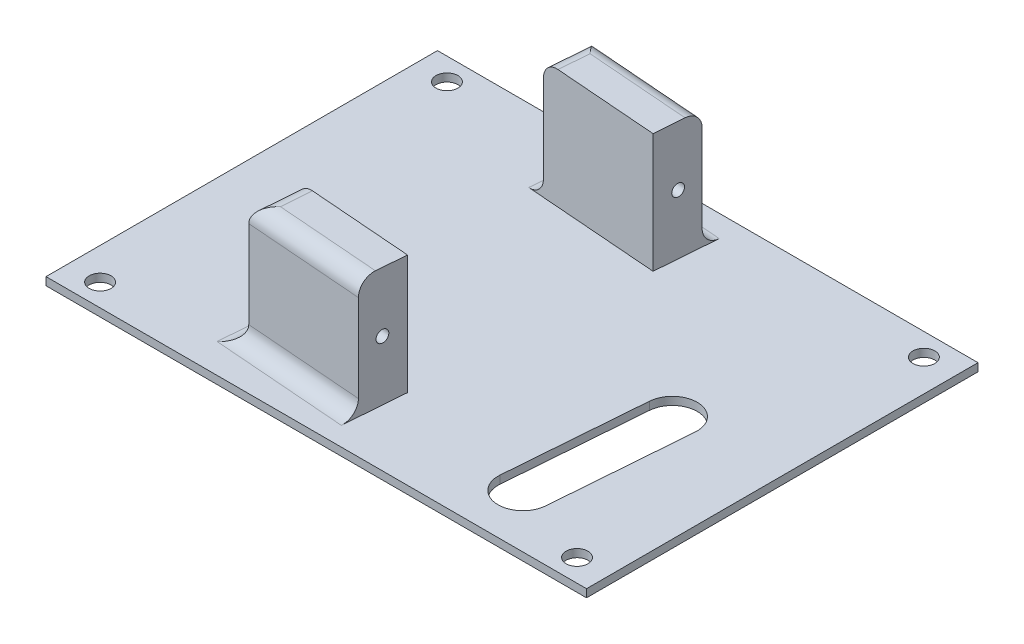
ISO-10303-21;
HEADER;
FILE_DESCRIPTION(('STEP AP214'),'2;1');
FILE_NAME('part.step','',(''),(''),'','','');
FILE_SCHEMA(('AUTOMOTIVE_DESIGN { 1 0 10303 214 1 1 1 1 }'));
ENDSEC;
DATA;
#1=APPLICATION_CONTEXT('core data for automotive mechanical design processes');
#2=APPLICATION_PROTOCOL_DEFINITION('international standard','automotive_design',2000,#1);
#3=PRODUCT_CONTEXT('',#1,'mechanical');
#4=PRODUCT('Part','Part','',(#3));
#5=PRODUCT_RELATED_PRODUCT_CATEGORY('part','',(#4));
#6=PRODUCT_DEFINITION_FORMATION('','',#4);
#7=PRODUCT_DEFINITION_CONTEXT('part definition',#1,'design');
#8=PRODUCT_DEFINITION('design','',#6,#7);
#9=PRODUCT_DEFINITION_SHAPE('','',#8);
#10=(LENGTH_UNIT() NAMED_UNIT(*) SI_UNIT(.MILLI.,.METRE.));
#11=(NAMED_UNIT(*) PLANE_ANGLE_UNIT() SI_UNIT($,.RADIAN.));
#12=(NAMED_UNIT(*) SI_UNIT($,.STERADIAN.) SOLID_ANGLE_UNIT());
#13=UNCERTAINTY_MEASURE_WITH_UNIT(LENGTH_MEASURE(1.E-05),#10,'distance_accuracy_value','');
#14=(GEOMETRIC_REPRESENTATION_CONTEXT(3) GLOBAL_UNCERTAINTY_ASSIGNED_CONTEXT((#13)) GLOBAL_UNIT_ASSIGNED_CONTEXT((#10,
#11,#12)) REPRESENTATION_CONTEXT('',''));
#15=CARTESIAN_POINT('',(0.,0.,0.));
#16=DIRECTION('',(0.,0.,1.));
#17=DIRECTION('',(1.,0.,0.));
#18=AXIS2_PLACEMENT_3D('',#15,#16,#17);
#19=CARTESIAN_POINT('',(0.,0.8,0.));
#20=DIRECTION('',(1.,0.,0.));
#21=DIRECTION('',(0.,0.,-1.));
#22=AXIS2_PLACEMENT_3D('',#19,#20,#21);
#23=PLANE('',#22);
#24=DIRECTION('',(0.,0.,1.));
#25=VECTOR('',#24,1.);
#26=CARTESIAN_POINT('',(0.,0.,0.));
#27=LINE('',#26,#25);
#28=CARTESIAN_POINT('',(0.,0.,-39.4));
#29=VERTEX_POINT('',#28);
#30=CARTESIAN_POINT('',(0.,0.,0.));
#31=VERTEX_POINT('',#30);
#32=EDGE_CURVE('E306',#29,#31,#27,.T.);
#33=ORIENTED_EDGE('',*,*,#32,.T.);
#34=DIRECTION('',(0.,-1.,0.));
#35=VECTOR('',#34,1.);
#36=CARTESIAN_POINT('',(0.,0.8,0.));
#37=LINE('',#36,#35);
#38=CARTESIAN_POINT('',(0.,0.8,0.));
#39=VERTEX_POINT('',#38);
#40=EDGE_CURVE('E335',#39,#31,#37,.T.);
#41=ORIENTED_EDGE('',*,*,#40,.F.);
#42=DIRECTION('',(0.,0.,1.));
#43=VECTOR('',#42,1.);
#44=CARTESIAN_POINT('',(0.,0.8,0.));
#45=LINE('',#44,#43);
#46=CARTESIAN_POINT('',(0.,0.8,-39.4));
#47=VERTEX_POINT('',#46);
#48=EDGE_CURVE('E309',#47,#39,#45,.T.);
#49=ORIENTED_EDGE('',*,*,#48,.F.);
#50=DIRECTION('',(0.,-1.,0.));
#51=VECTOR('',#50,1.);
#52=CARTESIAN_POINT('',(0.,0.8,-39.4));
#53=LINE('',#52,#51);
#54=EDGE_CURVE('E319',#47,#29,#53,.T.);
#55=ORIENTED_EDGE('',*,*,#54,.T.);
#56=EDGE_LOOP('',(#33,#41,#49,#55));
#57=FACE_BOUND('',#56,.T.);
#58=ADVANCED_FACE('F43',(#57),#23,.F.);
#59=CARTESIAN_POINT('',(0.,0.8,0.));
#60=DIRECTION('',(0.,0.,-1.));
#61=DIRECTION('',(-1.,0.,0.));
#62=AXIS2_PLACEMENT_3D('',#59,#60,#61);
#63=PLANE('',#62);
#64=DIRECTION('',(1.,0.,0.));
#65=VECTOR('',#64,1.);
#66=CARTESIAN_POINT('',(0.,0.,0.));
#67=LINE('',#66,#65);
#68=CARTESIAN_POINT('',(54.4,0.,0.));
#69=VERTEX_POINT('',#68);
#70=EDGE_CURVE('E322',#31,#69,#67,.T.);
#71=ORIENTED_EDGE('',*,*,#70,.T.);
#72=DIRECTION('',(0.,-1.,0.));
#73=VECTOR('',#72,1.);
#74=CARTESIAN_POINT('',(54.4,0.8,0.));
#75=LINE('',#74,#73);
#76=CARTESIAN_POINT('',(54.4,0.8,0.));
#77=VERTEX_POINT('',#76);
#78=EDGE_CURVE('E332',#77,#69,#75,.T.);
#79=ORIENTED_EDGE('',*,*,#78,.F.);
#80=DIRECTION('',(1.,0.,0.));
#81=VECTOR('',#80,1.);
#82=CARTESIAN_POINT('',(0.,0.8,0.));
#83=LINE('',#82,#81);
#84=EDGE_CURVE('E312',#39,#77,#83,.T.);
#85=ORIENTED_EDGE('',*,*,#84,.F.);
#86=ORIENTED_EDGE('',*,*,#40,.T.);
#87=EDGE_LOOP('',(#71,#79,#85,#86));
#88=FACE_BOUND('',#87,.T.);
#89=ADVANCED_FACE('F449',(#88),#63,.F.);
#90=CARTESIAN_POINT('',(54.4,0.8,0.));
#91=DIRECTION('',(-1.,0.,0.));
#92=DIRECTION('',(0.,0.,1.));
#93=AXIS2_PLACEMENT_3D('',#90,#91,#92);
#94=PLANE('',#93);
#95=DIRECTION('',(0.,0.,-1.));
#96=VECTOR('',#95,1.);
#97=CARTESIAN_POINT('',(54.4,0.,0.));
#98=LINE('',#97,#96);
#99=CARTESIAN_POINT('',(54.4,0.,-39.4));
#100=VERTEX_POINT('',#99);
#101=EDGE_CURVE('E324',#69,#100,#98,.T.);
#102=ORIENTED_EDGE('',*,*,#101,.T.);
#103=DIRECTION('',(0.,-1.,0.));
#104=VECTOR('',#103,1.);
#105=CARTESIAN_POINT('',(54.4,0.8,-39.4));
#106=LINE('',#105,#104);
#107=CARTESIAN_POINT('',(54.4,0.8,-39.4));
#108=VERTEX_POINT('',#107);
#109=EDGE_CURVE('E329',#108,#100,#106,.T.);
#110=ORIENTED_EDGE('',*,*,#109,.F.);
#111=DIRECTION('',(0.,0.,-1.));
#112=VECTOR('',#111,1.);
#113=CARTESIAN_POINT('',(54.4,0.8,0.));
#114=LINE('',#113,#112);
#115=EDGE_CURVE('E315',#77,#108,#114,.T.);
#116=ORIENTED_EDGE('',*,*,#115,.F.);
#117=ORIENTED_EDGE('',*,*,#78,.T.);
#118=EDGE_LOOP('',(#102,#110,#116,#117));
#119=FACE_BOUND('',#118,.T.);
#120=ADVANCED_FACE('F455',(#119),#94,.F.);
#121=CARTESIAN_POINT('',(0.,0.8,-39.4));
#122=DIRECTION('',(0.,0.,1.));
#123=DIRECTION('',(1.,0.,0.));
#124=AXIS2_PLACEMENT_3D('',#121,#122,#123);
#125=PLANE('',#124);
#126=DIRECTION('',(-1.,0.,0.));
#127=VECTOR('',#126,1.);
#128=CARTESIAN_POINT('',(0.,0.,-39.4));
#129=LINE('',#128,#127);
#130=EDGE_CURVE('E313',#100,#29,#129,.T.);
#131=ORIENTED_EDGE('',*,*,#130,.T.);
#132=ORIENTED_EDGE('',*,*,#54,.F.);
#133=DIRECTION('',(-1.,0.,0.));
#134=VECTOR('',#133,1.);
#135=CARTESIAN_POINT('',(0.,0.8,-39.4));
#136=LINE('',#135,#134);
#137=EDGE_CURVE('E317',#108,#47,#136,.T.);
#138=ORIENTED_EDGE('',*,*,#137,.F.);
#139=ORIENTED_EDGE('',*,*,#109,.T.);
#140=EDGE_LOOP('',(#131,#132,#138,#139));
#141=FACE_BOUND('',#140,.T.);
#142=ADVANCED_FACE('F655',(#141),#125,.F.);
#143=CARTESIAN_POINT('',(0.,0.8,0.));
#144=DIRECTION('',(0.,-1.,0.));
#145=DIRECTION('',(0.,0.,-1.));
#146=AXIS2_PLACEMENT_3D('',#143,#144,#145);
#147=PLANE('',#146);
#148=CARTESIAN_POINT('',(42.6363450689998,0.8,-5.36196488668117));
#149=DIRECTION('',(0.,1.,0.));
#150=DIRECTION('',(0.,0.,1.));
#151=AXIS2_PLACEMENT_3D('',#148,#149,#150);
#152=CIRCLE('',#151,2.5);
#153=CARTESIAN_POINT('',(40.1438476958249,0.8,-5.55550259545118));
#154=VERTEX_POINT('',#153);
#155=CARTESIAN_POINT('',(45.1288424421748,0.8,-5.16842717791116));
#156=VERTEX_POINT('',#155);
#157=EDGE_CURVE('E233',#154,#156,#152,.T.);
#158=ORIENTED_EDGE('',*,*,#157,.F.);
#159=DIRECTION('',(-0.0774150835080043,0.,0.996998949269982));
#160=VECTOR('',#159,1.);
#161=CARTESIAN_POINT('',(39.4744727903479,0.8,3.06511818265889));
#162=LINE('',#161,#160);
#163=CARTESIAN_POINT('',(41.227658864937,0.8,-19.5134878852309));
#164=VERTEX_POINT('',#163);
#165=EDGE_CURVE('E203',#164,#154,#162,.T.);
#166=ORIENTED_EDGE('',*,*,#165,.F.);
#167=CARTESIAN_POINT('',(43.7201562381119,0.8,-19.3199501764609));
#168=DIRECTION('',(0.,1.,0.));
#169=DIRECTION('',(0.,0.,1.));
#170=AXIS2_PLACEMENT_3D('',#167,#168,#169);
#171=CIRCLE('',#170,2.5);
#172=CARTESIAN_POINT('',(46.2126536112869,0.8,-19.1264124676909));
#173=VERTEX_POINT('',#172);
#174=EDGE_CURVE('E221',#173,#164,#171,.T.);
#175=ORIENTED_EDGE('',*,*,#174,.F.);
#176=DIRECTION('',(-0.0774150835080043,0.,0.996998949269982));
#177=VECTOR('',#176,1.);
#178=CARTESIAN_POINT('',(44.4594675366978,0.8,3.45219360019891));
#179=LINE('',#178,#177);
#180=EDGE_CURVE('E224',#173,#156,#179,.T.);
#181=ORIENTED_EDGE('',*,*,#180,.T.);
#182=EDGE_LOOP('',(#158,#166,#175,#181));
#183=FACE_BOUND('',#182,.T.);
#184=DIRECTION('',(0.996998949269982,0.,0.0774150835080046));
#185=VECTOR('',#184,1.);
#186=CARTESIAN_POINT('',(3.05375947752351,0.8,-39.3281884156255));
#187=LINE('',#186,#185);
#188=CARTESIAN_POINT('',(17.0050591665599,0.8,-38.2448963707715));
#189=VERTEX_POINT('',#188);
#190=CARTESIAN_POINT('',(30.5642448766316,0.8,-37.1920512350627));
#191=VERTEX_POINT('',#190);
#192=EDGE_CURVE('E379',#189,#191,#187,.T.);
#193=ORIENTED_EDGE('',*,*,#192,.T.);
#194=DIRECTION('',(-0.077415083508005,0.,0.996998949269982));
#195=VECTOR('',#194,1.);
#196=CARTESIAN_POINT('',(27.5104853991081,0.8,2.13613718056285));
#197=LINE('',#196,#195);
#198=CARTESIAN_POINT('',(30.084271358882,0.8,-31.0106577495888));
#199=VERTEX_POINT('',#198);
#200=EDGE_CURVE('E60',#191,#199,#197,.T.);
#201=ORIENTED_EDGE('',*,*,#200,.T.);
#202=DIRECTION('',(0.996998949269982,0.,0.0774150835080049));
#203=VECTOR('',#202,1.);
#204=CARTESIAN_POINT('',(2.57378595977389,0.8,-33.1467949301516));
#205=LINE('',#204,#203);
#206=CARTESIAN_POINT('',(16.5250856488103,0.8,-32.0635028852977));
#207=VERTEX_POINT('',#206);
#208=EDGE_CURVE('E240',#207,#199,#205,.T.);
#209=ORIENTED_EDGE('',*,*,#208,.F.);
#210=DIRECTION('',(-0.0774150835080041,0.,0.996998949269982));
#211=VECTOR('',#210,1.);
#212=CARTESIAN_POINT('',(16.8811950329471,0.8,-36.6496980519396));
#213=LINE('',#212,#211);
#214=EDGE_CURVE('E68',#207,#189,#213,.F.);
#215=ORIENTED_EDGE('',*,*,#214,.T.);
#216=EDGE_LOOP('',(#193,#201,#209,#215));
#217=FACE_BOUND('',#216,.T.);
#218=DIRECTION('',(-0.0774150835080049,0.,0.996998949269982));
#219=VECTOR('',#218,1.);
#220=CARTESIAN_POINT('',(14.7445387281261,0.8,-9.13252705208806));
#221=LINE('',#220,#219);
#222=CARTESIAN_POINT('',(14.2645652103765,0.8,-2.95113356661417));
#223=VERTEX_POINT('',#222);
#224=CARTESIAN_POINT('',(14.7445387281261,0.8,-9.13252705208806));
#225=VERTEX_POINT('',#224);
#226=EDGE_CURVE('E375',#223,#225,#221,.F.);
#227=ORIENTED_EDGE('',*,*,#226,.T.);
#228=DIRECTION('',(0.996998949269982,0.,0.0774150835080043));
#229=VECTOR('',#228,1.);
#230=CARTESIAN_POINT('',(0.793239039089771,0.8,-10.215819096942));
#231=LINE('',#230,#229);
#232=CARTESIAN_POINT('',(28.3037244381979,0.8,-8.0796819163792));
#233=VERTEX_POINT('',#232);
#234=EDGE_CURVE('E262',#225,#233,#231,.T.);
#235=ORIENTED_EDGE('',*,*,#234,.T.);
#236=DIRECTION('',(0.0774150835080042,0.,-0.996998949269982));
#237=VECTOR('',#236,1.);
#238=CARTESIAN_POINT('',(27.5104853991081,0.8,2.13613718056283));
#239=LINE('',#238,#237);
#240=CARTESIAN_POINT('',(27.8237509204483,0.8,-1.89828843090531));
#241=VERTEX_POINT('',#240);
#242=EDGE_CURVE('E267',#241,#233,#239,.T.);
#243=ORIENTED_EDGE('',*,*,#242,.F.);
#244=DIRECTION('',(0.996998949269982,0.,0.0774150835080045));
#245=VECTOR('',#244,1.);
#246=CARTESIAN_POINT('',(15.8597635292085,0.8,-2.82726943300136));
#247=LINE('',#246,#245);
#248=EDGE_CURVE('E373',#241,#223,#247,.F.);
#249=ORIENTED_EDGE('',*,*,#248,.T.);
#250=EDGE_LOOP('',(#227,#235,#243,#249));
#251=FACE_BOUND('',#250,.T.);
#252=CARTESIAN_POINT('',(3.2,0.8,-37.155));
#253=DIRECTION('',(0.,1.,0.));
#254=DIRECTION('',(0.,0.,1.));
#255=AXIS2_PLACEMENT_3D('',#252,#253,#254);
#256=CIRCLE('',#255,1.1);
#257=CARTESIAN_POINT('',(3.2,0.8,-36.055));
#258=VERTEX_POINT('',#257);
#259=EDGE_CURVE('E298',#258,#258,#256,.T.);
#260=ORIENTED_EDGE('',*,*,#259,.F.);
#261=EDGE_LOOP('',(#260));
#262=FACE_BOUND('',#261,.T.);
#263=CARTESIAN_POINT('',(51.2,0.8,-2.24500000000001));
#264=DIRECTION('',(0.,1.,0.));
#265=DIRECTION('',(0.,0.,1.));
#266=AXIS2_PLACEMENT_3D('',#263,#264,#265);
#267=CIRCLE('',#266,1.1);
#268=CARTESIAN_POINT('',(51.2,0.8,-1.14500000000001));
#269=VERTEX_POINT('',#268);
#270=EDGE_CURVE('E292',#269,#269,#267,.T.);
#271=ORIENTED_EDGE('',*,*,#270,.F.);
#272=EDGE_LOOP('',(#271));
#273=FACE_BOUND('',#272,.T.);
#274=CARTESIAN_POINT('',(3.2,0.8,-2.245));
#275=DIRECTION('',(0.,1.,0.));
#276=DIRECTION('',(0.,0.,1.));
#277=AXIS2_PLACEMENT_3D('',#274,#275,#276);
#278=CIRCLE('',#277,1.1);
#279=CARTESIAN_POINT('',(3.2,0.8,-1.145));
#280=VERTEX_POINT('',#279);
#281=EDGE_CURVE('E285',#280,#280,#278,.T.);
#282=ORIENTED_EDGE('',*,*,#281,.F.);
#283=EDGE_LOOP('',(#282));
#284=FACE_BOUND('',#283,.T.);
#285=CARTESIAN_POINT('',(51.2,0.8,-37.155));
#286=DIRECTION('',(0.,1.,0.));
#287=DIRECTION('',(0.,0.,1.));
#288=AXIS2_PLACEMENT_3D('',#285,#286,#287);
#289=CIRCLE('',#288,1.1);
#290=CARTESIAN_POINT('',(51.2,0.8,-36.055));
#291=VERTEX_POINT('',#290);
#292=EDGE_CURVE('E288',#291,#291,#289,.T.);
#293=ORIENTED_EDGE('',*,*,#292,.F.);
#294=EDGE_LOOP('',(#293));
#295=FACE_BOUND('',#294,.T.);
#296=ORIENTED_EDGE('',*,*,#48,.T.);
#297=ORIENTED_EDGE('',*,*,#84,.T.);
#298=ORIENTED_EDGE('',*,*,#115,.T.);
#299=ORIENTED_EDGE('',*,*,#137,.T.);
#300=EDGE_LOOP('',(#296,#297,#298,#299));
#301=FACE_BOUND('',#300,.T.);
#302=ADVANCED_FACE('F429',(#183,#217,#251,#262,#273,#284,#295,#301),#147,.F.);
#303=CARTESIAN_POINT('',(0.,0.,0.));
#304=DIRECTION('',(0.,-1.,0.));
#305=DIRECTION('',(0.,0.,-1.));
#306=AXIS2_PLACEMENT_3D('',#303,#304,#305);
#307=PLANE('',#306);
#308=DIRECTION('',(-0.0774150835080043,0.,0.996998949269982));
#309=VECTOR('',#308,1.);
#310=CARTESIAN_POINT('',(39.4744727903479,0.,3.06511818265889));
#311=LINE('',#310,#309);
#312=CARTESIAN_POINT('',(41.227658864937,0.,-19.5134878852309));
#313=VERTEX_POINT('',#312);
#314=CARTESIAN_POINT('',(40.1438476958249,0.,-5.55550259545118));
#315=VERTEX_POINT('',#314);
#316=EDGE_CURVE('E200',#313,#315,#311,.T.);
#317=ORIENTED_EDGE('',*,*,#316,.T.);
#318=CARTESIAN_POINT('',(42.6363450689998,0.,-5.36196488668117));
#319=DIRECTION('',(0.,1.,0.));
#320=DIRECTION('',(0.,0.,1.));
#321=AXIS2_PLACEMENT_3D('',#318,#319,#320);
#322=CIRCLE('',#321,2.5);
#323=CARTESIAN_POINT('',(45.1288424421748,0.,-5.16842717791116));
#324=VERTEX_POINT('',#323);
#325=EDGE_CURVE('E211',#315,#324,#322,.T.);
#326=ORIENTED_EDGE('',*,*,#325,.T.);
#327=DIRECTION('',(-0.0774150835080043,0.,0.996998949269982));
#328=VECTOR('',#327,1.);
#329=CARTESIAN_POINT('',(44.4594675366978,0.,3.45219360019891));
#330=LINE('',#329,#328);
#331=CARTESIAN_POINT('',(46.2126536112869,0.,-19.1264124676909));
#332=VERTEX_POINT('',#331);
#333=EDGE_CURVE('E216',#332,#324,#330,.T.);
#334=ORIENTED_EDGE('',*,*,#333,.F.);
#335=CARTESIAN_POINT('',(43.7201562381119,0.,-19.3199501764609));
#336=DIRECTION('',(0.,1.,0.));
#337=DIRECTION('',(0.,0.,1.));
#338=AXIS2_PLACEMENT_3D('',#335,#336,#337);
#339=CIRCLE('',#338,2.5);
#340=EDGE_CURVE('E208',#332,#313,#339,.T.);
#341=ORIENTED_EDGE('',*,*,#340,.T.);
#342=EDGE_LOOP('',(#317,#326,#334,#341));
#343=FACE_BOUND('',#342,.T.);
#344=CARTESIAN_POINT('',(3.2,0.,-37.155));
#345=DIRECTION('',(0.,1.,0.));
#346=DIRECTION('',(0.,0.,1.));
#347=AXIS2_PLACEMENT_3D('',#344,#345,#346);
#348=CIRCLE('',#347,1.1);
#349=CARTESIAN_POINT('',(3.2,0.,-36.055));
#350=VERTEX_POINT('',#349);
#351=EDGE_CURVE('E284',#350,#350,#348,.T.);
#352=ORIENTED_EDGE('',*,*,#351,.T.);
#353=EDGE_LOOP('',(#352));
#354=FACE_BOUND('',#353,.T.);
#355=CARTESIAN_POINT('',(51.2,0.,-2.24500000000001));
#356=DIRECTION('',(0.,1.,0.));
#357=DIRECTION('',(0.,0.,1.));
#358=AXIS2_PLACEMENT_3D('',#355,#356,#357);
#359=CIRCLE('',#358,1.1);
#360=CARTESIAN_POINT('',(51.2,0.,-1.14500000000001));
#361=VERTEX_POINT('',#360);
#362=EDGE_CURVE('E295',#361,#361,#359,.T.);
#363=ORIENTED_EDGE('',*,*,#362,.T.);
#364=EDGE_LOOP('',(#363));
#365=FACE_BOUND('',#364,.T.);
#366=CARTESIAN_POINT('',(3.2,0.,-2.245));
#367=DIRECTION('',(0.,1.,0.));
#368=DIRECTION('',(0.,0.,1.));
#369=AXIS2_PLACEMENT_3D('',#366,#367,#368);
#370=CIRCLE('',#369,1.1);
#371=CARTESIAN_POINT('',(3.2,0.,-1.145));
#372=VERTEX_POINT('',#371);
#373=EDGE_CURVE('E289',#372,#372,#370,.T.);
#374=ORIENTED_EDGE('',*,*,#373,.T.);
#375=EDGE_LOOP('',(#374));
#376=FACE_BOUND('',#375,.T.);
#377=CARTESIAN_POINT('',(51.2,0.,-37.155));
#378=DIRECTION('',(0.,1.,0.));
#379=DIRECTION('',(0.,0.,1.));
#380=AXIS2_PLACEMENT_3D('',#377,#378,#379);
#381=CIRCLE('',#380,1.1);
#382=CARTESIAN_POINT('',(51.2,0.,-36.055));
#383=VERTEX_POINT('',#382);
#384=EDGE_CURVE('E303',#383,#383,#381,.T.);
#385=ORIENTED_EDGE('',*,*,#384,.T.);
#386=EDGE_LOOP('',(#385));
#387=FACE_BOUND('',#386,.T.);
#388=ORIENTED_EDGE('',*,*,#32,.F.);
#389=ORIENTED_EDGE('',*,*,#130,.F.);
#390=ORIENTED_EDGE('',*,*,#101,.F.);
#391=ORIENTED_EDGE('',*,*,#70,.F.);
#392=EDGE_LOOP('',(#388,#389,#390,#391));
#393=FACE_BOUND('',#392,.T.);
#394=ADVANCED_FACE('F218',(#343,#354,#365,#376,#387,#393),#307,.T.);
#395=CARTESIAN_POINT('',(51.2,0.,-37.155));
#396=DIRECTION('',(0.,1.,0.));
#397=DIRECTION('',(0.,0.,1.));
#398=AXIS2_PLACEMENT_3D('',#395,#396,#397);
#399=CYLINDRICAL_SURFACE('',#398,1.1);
#400=ORIENTED_EDGE('',*,*,#384,.F.);
#401=EDGE_LOOP('',(#400));
#402=FACE_BOUND('',#401,.T.);
#403=ORIENTED_EDGE('',*,*,#292,.T.);
#404=EDGE_LOOP('',(#403));
#405=FACE_BOUND('',#404,.T.);
#406=ADVANCED_FACE('F671',(#402,#405),#399,.F.);
#407=CARTESIAN_POINT('',(3.2,0.,-2.245));
#408=DIRECTION('',(0.,1.,0.));
#409=DIRECTION('',(0.,0.,1.));
#410=AXIS2_PLACEMENT_3D('',#407,#408,#409);
#411=CYLINDRICAL_SURFACE('',#410,1.1);
#412=ORIENTED_EDGE('',*,*,#373,.F.);
#413=EDGE_LOOP('',(#412));
#414=FACE_BOUND('',#413,.T.);
#415=ORIENTED_EDGE('',*,*,#281,.T.);
#416=EDGE_LOOP('',(#415));
#417=FACE_BOUND('',#416,.T.);
#418=ADVANCED_FACE('F678',(#414,#417),#411,.F.);
#419=CARTESIAN_POINT('',(51.2,0.,-2.24500000000001));
#420=DIRECTION('',(0.,1.,0.));
#421=DIRECTION('',(0.,0.,1.));
#422=AXIS2_PLACEMENT_3D('',#419,#420,#421);
#423=CYLINDRICAL_SURFACE('',#422,1.1);
#424=ORIENTED_EDGE('',*,*,#362,.F.);
#425=EDGE_LOOP('',(#424));
#426=FACE_BOUND('',#425,.T.);
#427=ORIENTED_EDGE('',*,*,#270,.T.);
#428=EDGE_LOOP('',(#427));
#429=FACE_BOUND('',#428,.T.);
#430=ADVANCED_FACE('F686',(#426,#429),#423,.F.);
#431=CARTESIAN_POINT('',(3.2,0.,-37.155));
#432=DIRECTION('',(0.,1.,0.));
#433=DIRECTION('',(0.,0.,1.));
#434=AXIS2_PLACEMENT_3D('',#431,#432,#433);
#435=CYLINDRICAL_SURFACE('',#434,1.1);
#436=ORIENTED_EDGE('',*,*,#351,.F.);
#437=EDGE_LOOP('',(#436));
#438=FACE_BOUND('',#437,.T.);
#439=ORIENTED_EDGE('',*,*,#259,.T.);
#440=EDGE_LOOP('',(#439));
#441=FACE_BOUND('',#440,.T.);
#442=ADVANCED_FACE('F644',(#438,#441),#435,.F.);
#443=CARTESIAN_POINT('',(0.793239039089771,12.8,-10.215819096942));
#444=DIRECTION('',(0.0774150835080043,0.,-0.996998949269982));
#445=DIRECTION('',(-0.996998949269982,0.,-0.0774150835080043));
#446=AXIS2_PLACEMENT_3D('',#443,#444,#445);
#447=PLANE('',#446);
#448=DIRECTION('',(0.,-1.,0.));
#449=VECTOR('',#448,1.);
#450=CARTESIAN_POINT('',(16.3397370469581,12.8,-9.00866291847525));
#451=LINE('',#450,#449);
#452=CARTESIAN_POINT('',(16.3397370469581,11.2,-9.00866291847525));
#453=VERTEX_POINT('',#452);
#454=CARTESIAN_POINT('',(16.3397370469581,2.4,-9.00866291847525));
#455=VERTEX_POINT('',#454);
#456=EDGE_CURVE('E281',#453,#455,#451,.T.);
#457=ORIENTED_EDGE('',*,*,#456,.F.);
#458=CARTESIAN_POINT('',(17.9349353657901,11.2,-8.88479878486245));
#459=DIRECTION('',(0.0774150835080043,0.,-0.996998949269982));
#460=DIRECTION('',(-0.996998949269982,0.,-0.0774150835080043));
#461=AXIS2_PLACEMENT_3D('',#458,#459,#460);
#462=CIRCLE('',#461,1.6);
#463=CARTESIAN_POINT('',(17.9349353657901,12.8,-8.88479878486245));
#464=VERTEX_POINT('',#463);
#465=EDGE_CURVE('E348',#453,#464,#462,.T.);
#466=ORIENTED_EDGE('',*,*,#465,.T.);
#467=DIRECTION('',(0.996998949269982,0.,0.0774150835080043));
#468=VECTOR('',#467,1.);
#469=CARTESIAN_POINT('',(0.793239039089771,12.8,-10.215819096942));
#470=LINE('',#469,#468);
#471=CARTESIAN_POINT('',(28.3037244381979,12.8,-8.0796819163792));
#472=VERTEX_POINT('',#471);
#473=EDGE_CURVE('E263',#464,#472,#470,.T.);
#474=ORIENTED_EDGE('',*,*,#473,.T.);
#475=DIRECTION('',(0.,-1.,0.));
#476=VECTOR('',#475,1.);
#477=CARTESIAN_POINT('',(28.3037244381979,12.8,-8.0796819163792));
#478=LINE('',#477,#476);
#479=EDGE_CURVE('E269',#472,#233,#478,.T.);
#480=ORIENTED_EDGE('',*,*,#479,.T.);
#481=ORIENTED_EDGE('',*,*,#234,.F.);
#482=CARTESIAN_POINT('',(14.7445387281261,2.4,-9.13252705208806));
#483=DIRECTION('',(0.0774150835080043,0.,-0.996998949269982));
#484=DIRECTION('',(-0.996998949269982,0.,-0.0774150835080043));
#485=AXIS2_PLACEMENT_3D('',#482,#483,#484);
#486=CIRCLE('',#485,1.6);
#487=EDGE_CURVE('E52',#225,#455,#486,.F.);
#488=ORIENTED_EDGE('',*,*,#487,.T.);
#489=EDGE_LOOP('',(#457,#466,#474,#480,#481,#488));
#490=FACE_BOUND('',#489,.T.);
#491=ADVANCED_FACE('F425',(#490),#447,.T.);
#492=CARTESIAN_POINT('',(15.5464980078683,12.8,1.20715617846679));
#493=DIRECTION('',(0.996998949269982,0.,0.0774150835080049));
#494=DIRECTION('',(0.0774150835080049,0.,-0.996998949269982));
#495=AXIS2_PLACEMENT_3D('',#492,#493,#494);
#496=PLANE('',#495);
#497=DIRECTION('',(0.,-1.,0.));
#498=VECTOR('',#497,1.);
#499=CARTESIAN_POINT('',(15.9836276628213,12.8,-4.42246775183333));
#500=LINE('',#499,#498);
#501=CARTESIAN_POINT('',(15.9836276628213,11.2,-4.42246775183333));
#502=VERTEX_POINT('',#501);
#503=CARTESIAN_POINT('',(15.9836276628213,2.4,-4.42246775183333));
#504=VERTEX_POINT('',#503);
#505=EDGE_CURVE('E278',#502,#504,#500,.T.);
#506=ORIENTED_EDGE('',*,*,#505,.F.);
#507=DIRECTION('',(-0.0774150835080049,0.,0.996998949269982));
#508=VECTOR('',#507,1.);
#509=CARTESIAN_POINT('',(16.3397370469581,11.2,-9.00866291847525));
#510=LINE('',#509,#508);
#511=EDGE_CURVE('E346',#502,#453,#510,.F.);
#512=ORIENTED_EDGE('',*,*,#511,.T.);
#513=ORIENTED_EDGE('',*,*,#456,.T.);
#514=DIRECTION('',(-0.0774150835080049,0.,0.996998949269982));
#515=VECTOR('',#514,1.);
#516=CARTESIAN_POINT('',(15.9836276628213,2.4,-4.42246775183333));
#517=LINE('',#516,#515);
#518=EDGE_CURVE('E343',#455,#504,#517,.T.);
#519=ORIENTED_EDGE('',*,*,#518,.T.);
#520=EDGE_LOOP('',(#506,#512,#513,#519));
#521=FACE_BOUND('',#520,.T.);
#522=ADVANCED_FACE('F410',(#521),#496,.F.);
#523=CARTESIAN_POINT('',(0.437129654952953,12.8,-5.62962393030012));
#524=DIRECTION('',(0.0774150835080045,0.,-0.996998949269982));
#525=DIRECTION('',(-0.996998949269982,0.,-0.0774150835080045));
#526=AXIS2_PLACEMENT_3D('',#523,#524,#525);
#527=PLANE('',#526);
#528=DIRECTION('',(0.,-1.,0.));
#529=VECTOR('',#528,1.);
#530=CARTESIAN_POINT('',(27.9476150540611,12.8,-3.49348674973728));
#531=LINE('',#530,#529);
#532=CARTESIAN_POINT('',(27.9476150540611,11.2,-3.49348674973728));
#533=VERTEX_POINT('',#532);
#534=CARTESIAN_POINT('',(27.9476150540611,2.4,-3.49348674973728));
#535=VERTEX_POINT('',#534);
#536=EDGE_CURVE('E275',#533,#535,#531,.T.);
#537=ORIENTED_EDGE('',*,*,#536,.F.);
#538=DIRECTION('',(0.996998949269982,0.,0.0774150835080045));
#539=VECTOR('',#538,1.);
#540=CARTESIAN_POINT('',(15.9836276628213,11.2,-4.42246775183333));
#541=LINE('',#540,#539);
#542=EDGE_CURVE('E354',#533,#502,#541,.F.);
#543=ORIENTED_EDGE('',*,*,#542,.T.);
#544=ORIENTED_EDGE('',*,*,#505,.T.);
#545=DIRECTION('',(0.996998949269982,0.,0.0774150835080045));
#546=VECTOR('',#545,1.);
#547=CARTESIAN_POINT('',(27.9476150540611,2.4,-3.49348674973728));
#548=LINE('',#547,#546);
#549=EDGE_CURVE('E352',#504,#535,#548,.T.);
#550=ORIENTED_EDGE('',*,*,#549,.T.);
#551=EDGE_LOOP('',(#537,#543,#544,#550));
#552=FACE_BOUND('',#551,.T.);
#553=ADVANCED_FACE('F413',(#552),#527,.F.);
#554=CARTESIAN_POINT('',(27.5104853991081,12.8,2.13613718056283));
#555=DIRECTION('',(-0.996998949269982,0.,-0.0774150835080042));
#556=DIRECTION('',(-0.0774150835080042,0.,0.996998949269982));
#557=AXIS2_PLACEMENT_3D('',#554,#555,#556);
#558=PLANE('',#557);
#559=CARTESIAN_POINT('',(28.1217989919541,6.8,-5.73673438559474));
#560=DIRECTION('',(0.996998949269982,0.,0.0774150835080042));
#561=DIRECTION('',(0.0774150835080042,0.,-0.996998949269982));
#562=AXIS2_PLACEMENT_3D('',#559,#560,#561);
#563=CIRCLE('',#562,0.6);
#564=CARTESIAN_POINT('',(28.1682480420589,6.8,-6.33493375515673));
#565=VERTEX_POINT('',#564);
#566=EDGE_CURVE('E890',#565,#565,#563,.T.);
#567=ORIENTED_EDGE('',*,*,#566,.F.);
#568=EDGE_LOOP('',(#567));
#569=FACE_BOUND('',#568,.T.);
#570=DIRECTION('',(0.0774150835080042,0.,-0.996998949269982));
#571=VECTOR('',#570,1.);
#572=CARTESIAN_POINT('',(27.5104853991081,12.8,2.13613718056283));
#573=LINE('',#572,#571);
#574=CARTESIAN_POINT('',(28.0714791876739,12.8,-5.08868506856925));
#575=VERTEX_POINT('',#574);
#576=EDGE_CURVE('E266',#575,#472,#573,.T.);
#577=ORIENTED_EDGE('',*,*,#576,.F.);
#578=CARTESIAN_POINT('',(28.0714791876739,11.2,-5.08868506856925));
#579=DIRECTION('',(-0.996998949269982,0.,-0.0774150835080042));
#580=DIRECTION('',(-0.0774150835080042,0.,0.996998949269982));
#581=AXIS2_PLACEMENT_3D('',#578,#579,#580);
#582=CIRCLE('',#581,1.6);
#583=EDGE_CURVE('E350',#575,#533,#582,.F.);
#584=ORIENTED_EDGE('',*,*,#583,.T.);
#585=ORIENTED_EDGE('',*,*,#536,.T.);
#586=CARTESIAN_POINT('',(27.8237509204483,2.4,-1.89828843090531));
#587=DIRECTION('',(-0.996998949269982,0.,-0.0774150835080042));
#588=DIRECTION('',(-0.0774150835080042,0.,0.996998949269982));
#589=AXIS2_PLACEMENT_3D('',#586,#587,#588);
#590=CIRCLE('',#589,1.6);
#591=EDGE_CURVE('E11',#535,#241,#590,.T.);
#592=ORIENTED_EDGE('',*,*,#591,.T.);
#593=ORIENTED_EDGE('',*,*,#242,.T.);
#594=ORIENTED_EDGE('',*,*,#479,.F.);
#595=EDGE_LOOP('',(#577,#584,#585,#592,#593,#594));
#596=FACE_BOUND('',#595,.T.);
#597=ADVANCED_FACE('F433',(#569,#596),#558,.F.);
#598=CARTESIAN_POINT('',(0.,12.8,0.));
#599=DIRECTION('',(0.,1.,0.));
#600=DIRECTION('',(0.,0.,1.));
#601=AXIS2_PLACEMENT_3D('',#598,#599,#600);
#602=PLANE('',#601);
#603=ORIENTED_EDGE('',*,*,#473,.F.);
#604=DIRECTION('',(-0.0774150835080049,0.,0.996998949269982));
#605=VECTOR('',#604,1.);
#606=CARTESIAN_POINT('',(17.5788259816533,12.8,-4.29860361822052));
#607=LINE('',#606,#605);
#608=CARTESIAN_POINT('',(17.7026901152661,12.8,-5.89380193705249));
#609=VERTEX_POINT('',#608);
#610=EDGE_CURVE('E340',#464,#609,#607,.T.);
#611=ORIENTED_EDGE('',*,*,#610,.T.);
#612=DIRECTION('',(0.996998949269982,0.,0.0774150835080045));
#613=VECTOR('',#612,1.);
#614=CARTESIAN_POINT('',(28.0714791876739,12.8,-5.08868506856925));
#615=LINE('',#614,#613);
#616=EDGE_CURVE('E338',#609,#575,#615,.T.);
#617=ORIENTED_EDGE('',*,*,#616,.T.);
#618=ORIENTED_EDGE('',*,*,#576,.T.);
#619=EDGE_LOOP('',(#603,#611,#617,#618));
#620=FACE_BOUND('',#619,.T.);
#621=ADVANCED_FACE('F435',(#620),#602,.T.);
#622=CARTESIAN_POINT('',(2.9298953439107,12.8,-37.7329900967936));
#623=DIRECTION('',(0.0774150835080046,0.,-0.996998949269982));
#624=DIRECTION('',(-0.996998949269982,0.,-0.0774150835080046));
#625=AXIS2_PLACEMENT_3D('',#622,#623,#624);
#626=PLANE('',#625);
#627=DIRECTION('',(0.,-1.,0.));
#628=VECTOR('',#627,1.);
#629=CARTESIAN_POINT('',(18.476393351779,12.8,-36.5258339183268));
#630=LINE('',#629,#628);
#631=CARTESIAN_POINT('',(18.476393351779,11.2,-36.5258339183268));
#632=VERTEX_POINT('',#631);
#633=CARTESIAN_POINT('',(18.476393351779,2.4,-36.5258339183268));
#634=VERTEX_POINT('',#633);
#635=EDGE_CURVE('E259',#632,#634,#630,.T.);
#636=ORIENTED_EDGE('',*,*,#635,.F.);
#637=DIRECTION('',(0.996998949269982,0.,0.0774150835080046));
#638=VECTOR('',#637,1.);
#639=CARTESIAN_POINT('',(2.9298953439107,11.2,-37.7329900967936));
#640=LINE('',#639,#638);
#641=CARTESIAN_POINT('',(30.4403807430188,11.2,-35.5968529162307));
#642=VERTEX_POINT('',#641);
#643=EDGE_CURVE('E358',#632,#642,#640,.T.);
#644=ORIENTED_EDGE('',*,*,#643,.T.);
#645=DIRECTION('',(0.,-1.,0.));
#646=VECTOR('',#645,1.);
#647=CARTESIAN_POINT('',(30.4403807430188,12.8,-35.5968529162307));
#648=LINE('',#647,#646);
#649=CARTESIAN_POINT('',(30.4403807430188,2.4,-35.5968529162307));
#650=VERTEX_POINT('',#649);
#651=EDGE_CURVE('E249',#642,#650,#648,.T.);
#652=ORIENTED_EDGE('',*,*,#651,.T.);
#653=DIRECTION('',(0.996998949269982,0.,0.0774150835080046));
#654=VECTOR('',#653,1.);
#655=CARTESIAN_POINT('',(2.9298953439107,2.4,-37.7329900967936));
#656=LINE('',#655,#654);
#657=EDGE_CURVE('E356',#650,#634,#656,.F.);
#658=ORIENTED_EDGE('',*,*,#657,.T.);
#659=EDGE_LOOP('',(#636,#644,#652,#658));
#660=FACE_BOUND('',#659,.T.);
#661=ADVANCED_FACE('F437',(#660),#626,.T.);
#662=CARTESIAN_POINT('',(15.5464980078684,12.8,1.20715617846678));
#663=DIRECTION('',(0.996998949269982,0.,0.0774150835080041));
#664=DIRECTION('',(0.0774150835080041,0.,-0.996998949269982));
#665=AXIS2_PLACEMENT_3D('',#662,#663,#664);
#666=PLANE('',#665);
#667=DIRECTION('',(0.,-1.,0.));
#668=VECTOR('',#667,1.);
#669=CARTESIAN_POINT('',(18.1202839676422,12.8,-31.9396387516848));
#670=LINE('',#669,#668);
#671=CARTESIAN_POINT('',(18.1202839676422,11.2,-31.9396387516848));
#672=VERTEX_POINT('',#671);
#673=CARTESIAN_POINT('',(18.1202839676422,2.4,-31.9396387516848));
#674=VERTEX_POINT('',#673);
#675=EDGE_CURVE('E256',#672,#674,#670,.T.);
#676=ORIENTED_EDGE('',*,*,#675,.F.);
#677=DIRECTION('',(-0.0774150835080041,0.,0.996998949269982));
#678=VECTOR('',#677,1.);
#679=CARTESIAN_POINT('',(18.4763933517791,11.2,-36.5258339183268));
#680=LINE('',#679,#678);
#681=EDGE_CURVE('E371',#672,#632,#680,.F.);
#682=ORIENTED_EDGE('',*,*,#681,.T.);
#683=ORIENTED_EDGE('',*,*,#635,.T.);
#684=DIRECTION('',(-0.0774150835080041,0.,0.996998949269982));
#685=VECTOR('',#684,1.);
#686=CARTESIAN_POINT('',(18.1202839676422,2.4,-31.9396387516849));
#687=LINE('',#686,#685);
#688=EDGE_CURVE('E369',#634,#674,#687,.T.);
#689=ORIENTED_EDGE('',*,*,#688,.T.);
#690=EDGE_LOOP('',(#676,#682,#683,#689));
#691=FACE_BOUND('',#690,.T.);
#692=ADVANCED_FACE('F443',(#691),#666,.F.);
#693=CARTESIAN_POINT('',(2.57378595977389,12.8,-33.1467949301516));
#694=DIRECTION('',(0.0774150835080049,0.,-0.996998949269982));
#695=DIRECTION('',(-0.996998949269982,0.,-0.0774150835080049));
#696=AXIS2_PLACEMENT_3D('',#693,#694,#695);
#697=PLANE('',#696);
#698=DIRECTION('',(0.996998949269982,0.,0.0774150835080049));
#699=VECTOR('',#698,1.);
#700=CARTESIAN_POINT('',(2.57378595977389,12.8,-33.1467949301516));
#701=LINE('',#700,#699);
#702=CARTESIAN_POINT('',(19.7154822864742,12.8,-31.815774618072));
#703=VERTEX_POINT('',#702);
#704=CARTESIAN_POINT('',(30.084271358882,12.8,-31.0106577495888));
#705=VERTEX_POINT('',#704);
#706=EDGE_CURVE('E244',#703,#705,#701,.T.);
#707=ORIENTED_EDGE('',*,*,#706,.F.);
#708=CARTESIAN_POINT('',(19.7154822864742,11.2,-31.815774618072));
#709=DIRECTION('',(0.0774150835080049,0.,-0.996998949269982));
#710=DIRECTION('',(-0.996998949269982,0.,-0.0774150835080049));
#711=AXIS2_PLACEMENT_3D('',#708,#709,#710);
#712=CIRCLE('',#711,1.6);
#713=EDGE_CURVE('E367',#703,#672,#712,.F.);
#714=ORIENTED_EDGE('',*,*,#713,.T.);
#715=ORIENTED_EDGE('',*,*,#675,.T.);
#716=CARTESIAN_POINT('',(16.5250856488103,2.4,-32.0635028852977));
#717=DIRECTION('',(0.0774150835080049,0.,-0.996998949269982));
#718=DIRECTION('',(-0.996998949269982,0.,-0.0774150835080049));
#719=AXIS2_PLACEMENT_3D('',#716,#717,#718);
#720=CIRCLE('',#719,1.6);
#721=EDGE_CURVE('E383',#674,#207,#720,.T.);
#722=ORIENTED_EDGE('',*,*,#721,.T.);
#723=ORIENTED_EDGE('',*,*,#208,.T.);
#724=DIRECTION('',(0.,-1.,0.));
#725=VECTOR('',#724,1.);
#726=CARTESIAN_POINT('',(30.084271358882,12.8,-31.0106577495888));
#727=LINE('',#726,#725);
#728=EDGE_CURVE('E254',#705,#199,#727,.T.);
#729=ORIENTED_EDGE('',*,*,#728,.F.);
#730=EDGE_LOOP('',(#707,#714,#715,#722,#723,#729));
#731=FACE_BOUND('',#730,.T.);
#732=ADVANCED_FACE('F585',(#731),#697,.F.);
#733=CARTESIAN_POINT('',(27.5104853991081,12.8,2.13613718056285));
#734=DIRECTION('',(0.996998949269982,0.,0.077415083508005));
#735=DIRECTION('',(0.077415083508005,0.,-0.996998949269982));
#736=AXIS2_PLACEMENT_3D('',#733,#734,#735);
#737=PLANE('',#736);
#738=CARTESIAN_POINT('',(30.2661968051258,6.8,-33.3536052803732));
#739=DIRECTION('',(0.996998949269982,0.,0.0774150835080042));
#740=DIRECTION('',(-0.0774150835080042,0.,0.996998949269982));
#741=AXIS2_PLACEMENT_3D('',#738,#739,#740);
#742=CIRCLE('',#741,0.600000000000001);
#743=CARTESIAN_POINT('',(30.219747755021,6.8,-32.7554059108113));
#744=VERTEX_POINT('',#743);
#745=EDGE_CURVE('E888',#744,#744,#742,.T.);
#746=ORIENTED_EDGE('',*,*,#745,.F.);
#747=EDGE_LOOP('',(#746));
#748=FACE_BOUND('',#747,.T.);
#749=ORIENTED_EDGE('',*,*,#651,.F.);
#750=CARTESIAN_POINT('',(30.316516609406,11.2,-34.0016545973987));
#751=DIRECTION('',(0.996998949269982,0.,0.077415083508005));
#752=DIRECTION('',(0.077415083508005,0.,-0.996998949269982));
#753=AXIS2_PLACEMENT_3D('',#750,#751,#752);
#754=CIRCLE('',#753,1.6);
#755=CARTESIAN_POINT('',(30.316516609406,12.8,-34.0016545973987));
#756=VERTEX_POINT('',#755);
#757=EDGE_CURVE('E361',#642,#756,#754,.T.);
#758=ORIENTED_EDGE('',*,*,#757,.T.);
#759=DIRECTION('',(-0.077415083508005,0.,0.996998949269982));
#760=VECTOR('',#759,1.);
#761=CARTESIAN_POINT('',(27.5104853991081,12.8,2.13613718056285));
#762=LINE('',#761,#760);
#763=EDGE_CURVE('E246',#756,#705,#762,.T.);
#764=ORIENTED_EDGE('',*,*,#763,.T.);
#765=ORIENTED_EDGE('',*,*,#728,.T.);
#766=ORIENTED_EDGE('',*,*,#200,.F.);
#767=CARTESIAN_POINT('',(30.5642448766316,2.4,-37.1920512350627));
#768=DIRECTION('',(0.996998949269982,0.,0.077415083508005));
#769=DIRECTION('',(0.077415083508005,0.,-0.996998949269982));
#770=AXIS2_PLACEMENT_3D('',#767,#768,#769);
#771=CIRCLE('',#770,1.6);
#772=EDGE_CURVE('E381',#191,#650,#771,.F.);
#773=ORIENTED_EDGE('',*,*,#772,.T.);
#774=EDGE_LOOP('',(#749,#758,#764,#765,#766,#773));
#775=FACE_BOUND('',#774,.T.);
#776=ADVANCED_FACE('F577',(#748,#775),#737,.T.);
#777=CARTESIAN_POINT('',(0.,12.8,0.));
#778=DIRECTION('',(0.,1.,0.));
#779=DIRECTION('',(0.,0.,1.));
#780=AXIS2_PLACEMENT_3D('',#777,#778,#779);
#781=PLANE('',#780);
#782=ORIENTED_EDGE('',*,*,#763,.F.);
#783=DIRECTION('',(0.996998949269982,0.,0.0774150835080046));
#784=VECTOR('',#783,1.);
#785=CARTESIAN_POINT('',(2.80603121029789,12.8,-36.1377917779616));
#786=LINE('',#785,#784);
#787=CARTESIAN_POINT('',(19.9477275369982,12.8,-34.806771465882));
#788=VERTEX_POINT('',#787);
#789=EDGE_CURVE('E365',#756,#788,#786,.F.);
#790=ORIENTED_EDGE('',*,*,#789,.T.);
#791=DIRECTION('',(-0.0774150835080041,0.,0.996998949269982));
#792=VECTOR('',#791,1.);
#793=CARTESIAN_POINT('',(19.7154822864742,12.8,-31.8157746180721));
#794=LINE('',#793,#792);
#795=EDGE_CURVE('E363',#788,#703,#794,.T.);
#796=ORIENTED_EDGE('',*,*,#795,.T.);
#797=ORIENTED_EDGE('',*,*,#706,.T.);
#798=EDGE_LOOP('',(#782,#790,#796,#797));
#799=FACE_BOUND('',#798,.T.);
#800=ADVANCED_FACE('F570',(#799),#781,.T.);
#801=CARTESIAN_POINT('',(39.4744727903479,0.,3.06511818265889));
#802=DIRECTION('',(-0.996998949269982,0.,-0.0774150835080044));
#803=DIRECTION('',(-0.0774150835080044,0.,0.996998949269982));
#804=AXIS2_PLACEMENT_3D('',#801,#802,#803);
#805=PLANE('',#804);
#806=ORIENTED_EDGE('',*,*,#165,.T.);
#807=DIRECTION('',(0.,1.,0.));
#808=VECTOR('',#807,1.);
#809=CARTESIAN_POINT('',(40.1438476958249,0.,-5.55550259545118));
#810=LINE('',#809,#808);
#811=EDGE_CURVE('E196',#315,#154,#810,.T.);
#812=ORIENTED_EDGE('',*,*,#811,.F.);
#813=ORIENTED_EDGE('',*,*,#316,.F.);
#814=DIRECTION('',(0.,1.,0.));
#815=VECTOR('',#814,1.);
#816=CARTESIAN_POINT('',(41.227658864937,0.,-19.5134878852309));
#817=LINE('',#816,#815);
#818=EDGE_CURVE('E238',#313,#164,#817,.T.);
#819=ORIENTED_EDGE('',*,*,#818,.T.);
#820=EDGE_LOOP('',(#806,#812,#813,#819));
#821=FACE_BOUND('',#820,.T.);
#822=ADVANCED_FACE('F198',(#821),#805,.F.);
#823=CARTESIAN_POINT('',(43.7201562381119,0.,-19.3199501764609));
#824=DIRECTION('',(0.,1.,0.));
#825=DIRECTION('',(0.,0.,1.));
#826=AXIS2_PLACEMENT_3D('',#823,#824,#825);
#827=CYLINDRICAL_SURFACE('',#826,2.5);
#828=ORIENTED_EDGE('',*,*,#174,.T.);
#829=ORIENTED_EDGE('',*,*,#818,.F.);
#830=ORIENTED_EDGE('',*,*,#340,.F.);
#831=DIRECTION('',(0.,1.,0.));
#832=VECTOR('',#831,1.);
#833=CARTESIAN_POINT('',(46.2126536112869,0.,-19.1264124676909));
#834=LINE('',#833,#832);
#835=EDGE_CURVE('E241',#332,#173,#834,.T.);
#836=ORIENTED_EDGE('',*,*,#835,.T.);
#837=EDGE_LOOP('',(#828,#829,#830,#836));
#838=FACE_BOUND('',#837,.T.);
#839=ADVANCED_FACE('F555',(#838),#827,.F.);
#840=CARTESIAN_POINT('',(44.4594675366978,0.,3.45219360019891));
#841=DIRECTION('',(-0.996998949269982,0.,-0.0774150835080044));
#842=DIRECTION('',(-0.0774150835080044,0.,0.996998949269982));
#843=AXIS2_PLACEMENT_3D('',#840,#841,#842);
#844=PLANE('',#843);
#845=ORIENTED_EDGE('',*,*,#180,.F.);
#846=ORIENTED_EDGE('',*,*,#835,.F.);
#847=ORIENTED_EDGE('',*,*,#333,.T.);
#848=DIRECTION('',(0.,1.,0.));
#849=VECTOR('',#848,1.);
#850=CARTESIAN_POINT('',(45.1288424421748,0.,-5.16842717791116));
#851=LINE('',#850,#849);
#852=EDGE_CURVE('E207',#324,#156,#851,.T.);
#853=ORIENTED_EDGE('',*,*,#852,.T.);
#854=EDGE_LOOP('',(#845,#846,#847,#853));
#855=FACE_BOUND('',#854,.T.);
#856=ADVANCED_FACE('F548',(#855),#844,.T.);
#857=CARTESIAN_POINT('',(42.6363450689998,0.,-5.36196488668117));
#858=DIRECTION('',(0.,1.,0.));
#859=DIRECTION('',(0.,0.,1.));
#860=AXIS2_PLACEMENT_3D('',#857,#858,#859);
#861=CYLINDRICAL_SURFACE('',#860,2.5);
#862=ORIENTED_EDGE('',*,*,#157,.T.);
#863=ORIENTED_EDGE('',*,*,#852,.F.);
#864=ORIENTED_EDGE('',*,*,#325,.F.);
#865=ORIENTED_EDGE('',*,*,#811,.T.);
#866=EDGE_LOOP('',(#862,#863,#864,#865));
#867=FACE_BOUND('',#866,.T.);
#868=ADVANCED_FACE('F212',(#867),#861,.F.);
#869=CARTESIAN_POINT('',(24.2842031095059,6.8,-33.8180957814213));
#870=DIRECTION('',(0.996998949269982,0.,0.0774150835080042));
#871=DIRECTION('',(0.0774150835080042,0.,-0.996998949269982));
#872=AXIS2_PLACEMENT_3D('',#869,#870,#871);
#873=CYLINDRICAL_SURFACE('',#872,0.600000000000001);
#874=CARTESIAN_POINT('',(24.2842031095059,6.8,-33.8180957814213));
#875=DIRECTION('',(0.996998949269982,0.,0.0774150835080042));
#876=DIRECTION('',(-0.0774150835080042,0.,0.996998949269982));
#877=AXIS2_PLACEMENT_3D('',#874,#875,#876);
#878=CIRCLE('',#877,0.600000000000001);
#879=CARTESIAN_POINT('',(24.2377540594011,6.8,-33.2198964118593));
#880=VERTEX_POINT('',#879);
#881=EDGE_CURVE('E227',#880,#880,#878,.T.);
#882=ORIENTED_EDGE('',*,*,#881,.F.);
#883=EDGE_LOOP('',(#882));
#884=FACE_BOUND('',#883,.T.);
#885=ORIENTED_EDGE('',*,*,#745,.T.);
#886=EDGE_LOOP('',(#885));
#887=FACE_BOUND('',#886,.T.);
#888=ADVANCED_FACE('F533',(#884,#887),#873,.F.);
#889=CARTESIAN_POINT('',(24.2842031095059,6.8,-33.8180957814213));
#890=DIRECTION('',(-0.996998949269982,0.,-0.0774150835080042));
#891=DIRECTION('',(-0.0774150835080042,0.,0.996998949269982));
#892=AXIS2_PLACEMENT_3D('',#889,#890,#891);
#893=PLANE('',#892);
#894=ORIENTED_EDGE('',*,*,#881,.T.);
#895=EDGE_LOOP('',(#894));
#896=FACE_BOUND('',#895,.T.);
#897=ADVANCED_FACE('F525',(#896),#893,.F.);
#898=CARTESIAN_POINT('',(22.1398052963342,6.8,-6.20122488664276));
#899=DIRECTION('',(0.996998949269982,0.,0.0774150835080042));
#900=DIRECTION('',(0.0774150835080042,0.,-0.996998949269982));
#901=AXIS2_PLACEMENT_3D('',#898,#899,#900);
#902=CYLINDRICAL_SURFACE('',#901,0.6);
#903=CARTESIAN_POINT('',(22.1398052963342,6.8,-6.20122488664276));
#904=DIRECTION('',(0.996998949269982,0.,0.0774150835080042));
#905=DIRECTION('',(0.0774150835080042,0.,-0.996998949269982));
#906=AXIS2_PLACEMENT_3D('',#903,#904,#905);
#907=CIRCLE('',#906,0.6);
#908=CARTESIAN_POINT('',(22.186254346439,6.8,-6.79942425620475));
#909=VERTEX_POINT('',#908);
#910=EDGE_CURVE('E234',#909,#909,#907,.T.);
#911=ORIENTED_EDGE('',*,*,#910,.F.);
#912=EDGE_LOOP('',(#911));
#913=FACE_BOUND('',#912,.T.);
#914=ORIENTED_EDGE('',*,*,#566,.T.);
#915=EDGE_LOOP('',(#914));
#916=FACE_BOUND('',#915,.T.);
#917=ADVANCED_FACE('F516',(#913,#916),#902,.F.);
#918=CARTESIAN_POINT('',(22.1398052963342,6.8,-6.20122488664276));
#919=DIRECTION('',(0.996998949269982,0.,0.0774150835080042));
#920=DIRECTION('',(0.0774150835080042,0.,-0.996998949269982));
#921=AXIS2_PLACEMENT_3D('',#918,#919,#920);
#922=PLANE('',#921);
#923=ORIENTED_EDGE('',*,*,#910,.T.);
#924=EDGE_LOOP('',(#923));
#925=FACE_BOUND('',#924,.T.);
#926=ADVANCED_FACE('F465',(#925),#922,.T.);
#927=CARTESIAN_POINT('',(0.56099378856576,11.2,-7.22482224913209));
#928=DIRECTION('',(-0.996998949269982,0.,-0.0774150835080045));
#929=DIRECTION('',(-0.0774150835080045,0.,0.996998949269982));
#930=AXIS2_PLACEMENT_3D('',#927,#928,#929);
#931=CYLINDRICAL_SURFACE('',#930,1.6);
#932=ORIENTED_EDGE('',*,*,#583,.F.);
#933=ORIENTED_EDGE('',*,*,#616,.F.);
#934=CARTESIAN_POINT('',(17.7026901152661,11.2,-5.89380193705249));
#935=DIRECTION('',(-0.650243987350034,0.,-0.7597254483793));
#936=DIRECTION('',(-0.7597254483793,0.,0.650243987350034));
#937=AXIS2_PLACEMENT_3D('',#934,#935,#936);
#938=ELLIPSE('',#937,2.26274169979695,1.6);
#939=EDGE_CURVE('E387',#502,#609,#938,.T.);
#940=ORIENTED_EDGE('',*,*,#939,.F.);
#941=ORIENTED_EDGE('',*,*,#542,.F.);
#942=EDGE_LOOP('',(#932,#933,#940,#941));
#943=FACE_BOUND('',#942,.T.);
#944=ADVANCED_FACE('F418',(#943),#931,.T.);
#945=CARTESIAN_POINT('',(17.1416963267003,11.2,1.3310203120796));
#946=DIRECTION('',(0.0774150835080049,0.,-0.996998949269982));
#947=DIRECTION('',(-0.996998949269982,0.,-0.0774150835080049));
#948=AXIS2_PLACEMENT_3D('',#945,#946,#947);
#949=CYLINDRICAL_SURFACE('',#948,1.6);
#950=ORIENTED_EDGE('',*,*,#465,.F.);
#951=ORIENTED_EDGE('',*,*,#511,.F.);
#952=ORIENTED_EDGE('',*,*,#939,.T.);
#953=ORIENTED_EDGE('',*,*,#610,.F.);
#954=EDGE_LOOP('',(#950,#951,#952,#953));
#955=FACE_BOUND('',#954,.T.);
#956=ADVANCED_FACE('F423',(#955),#949,.T.);
#957=CARTESIAN_POINT('',(17.1416963267003,11.2,1.33102031207959));
#958=DIRECTION('',(0.0774150835080041,0.,-0.996998949269982));
#959=DIRECTION('',(-0.996998949269982,0.,-0.0774150835080041));
#960=AXIS2_PLACEMENT_3D('',#957,#958,#959);
#961=CYLINDRICAL_SURFACE('',#960,1.6);
#962=ORIENTED_EDGE('',*,*,#713,.F.);
#963=ORIENTED_EDGE('',*,*,#795,.F.);
#964=CARTESIAN_POINT('',(19.9477275369982,11.2,-34.806771465882));
#965=DIRECTION('',(0.7597254483793,0.,-0.650243987350034));
#966=DIRECTION('',(-0.650243987350034,0.,-0.7597254483793));
#967=AXIS2_PLACEMENT_3D('',#964,#965,#966);
#968=ELLIPSE('',#967,2.26274169979695,1.6);
#969=EDGE_CURVE('E389',#632,#788,#968,.T.);
#970=ORIENTED_EDGE('',*,*,#969,.F.);
#971=ORIENTED_EDGE('',*,*,#681,.F.);
#972=EDGE_LOOP('',(#962,#963,#970,#971));
#973=FACE_BOUND('',#972,.T.);
#974=ADVANCED_FACE('F462',(#973),#961,.T.);
#975=CARTESIAN_POINT('',(2.80603121029789,11.2,-36.1377917779616));
#976=DIRECTION('',(0.996998949269982,0.,0.0774150835080046));
#977=DIRECTION('',(0.0774150835080046,0.,-0.996998949269982));
#978=AXIS2_PLACEMENT_3D('',#975,#976,#977);
#979=CYLINDRICAL_SURFACE('',#978,1.6);
#980=ORIENTED_EDGE('',*,*,#969,.T.);
#981=ORIENTED_EDGE('',*,*,#789,.F.);
#982=ORIENTED_EDGE('',*,*,#757,.F.);
#983=ORIENTED_EDGE('',*,*,#643,.F.);
#984=EDGE_LOOP('',(#980,#981,#982,#983));
#985=FACE_BOUND('',#984,.T.);
#986=ADVANCED_FACE('F466',(#985),#979,.T.);
#987=CARTESIAN_POINT('',(13.9512996890364,2.4,1.08329204485398));
#988=DIRECTION('',(0.0774150835080041,0.,-0.996998949269982));
#989=DIRECTION('',(-0.996998949269982,0.,-0.0774150835080041));
#990=AXIS2_PLACEMENT_3D('',#987,#988,#989);
#991=CYLINDRICAL_SURFACE('',#990,1.6);
#992=ORIENTED_EDGE('',*,*,#721,.F.);
#993=ORIENTED_EDGE('',*,*,#688,.F.);
#994=CARTESIAN_POINT('',(17.0050591665599,2.4,-38.2448963707715));
#995=DIRECTION('',(0.7597254483793,0.,-0.650243987350034));
#996=DIRECTION('',(-0.650243987350034,0.,-0.7597254483793));
#997=AXIS2_PLACEMENT_3D('',#994,#995,#996);
#998=ELLIPSE('',#997,2.26274169979695,1.6);
#999=EDGE_CURVE('E391',#189,#634,#998,.F.);
#1000=ORIENTED_EDGE('',*,*,#999,.F.);
#1001=ORIENTED_EDGE('',*,*,#214,.F.);
#1002=EDGE_LOOP('',(#992,#993,#1000,#1001));
#1003=FACE_BOUND('',#1002,.T.);
#1004=ADVANCED_FACE('F469',(#1003),#991,.F.);
#1005=CARTESIAN_POINT('',(3.05375947752351,2.4,-39.3281884156255));
#1006=DIRECTION('',(0.996998949269982,0.,0.0774150835080046));
#1007=DIRECTION('',(0.0774150835080046,0.,-0.996998949269982));
#1008=AXIS2_PLACEMENT_3D('',#1005,#1006,#1007);
#1009=CYLINDRICAL_SURFACE('',#1008,1.6);
#1010=ORIENTED_EDGE('',*,*,#999,.T.);
#1011=ORIENTED_EDGE('',*,*,#657,.F.);
#1012=ORIENTED_EDGE('',*,*,#772,.F.);
#1013=ORIENTED_EDGE('',*,*,#192,.F.);
#1014=EDGE_LOOP('',(#1010,#1011,#1012,#1013));
#1015=FACE_BOUND('',#1014,.T.);
#1016=ADVANCED_FACE('F474',(#1015),#1009,.F.);
#1017=CARTESIAN_POINT('',(0.313265521340146,2.4,-4.03442561146815));
#1018=DIRECTION('',(-0.996998949269982,0.,-0.0774150835080045));
#1019=DIRECTION('',(-0.0774150835080045,0.,0.996998949269982));
#1020=AXIS2_PLACEMENT_3D('',#1017,#1018,#1019);
#1021=CYLINDRICAL_SURFACE('',#1020,1.6);
#1022=ORIENTED_EDGE('',*,*,#591,.F.);
#1023=ORIENTED_EDGE('',*,*,#549,.F.);
#1024=CARTESIAN_POINT('',(14.2645652103765,2.4,-2.95113356661417));
#1025=DIRECTION('',(-0.650243987350034,0.,-0.7597254483793));
#1026=DIRECTION('',(-0.7597254483793,0.,0.650243987350034));
#1027=AXIS2_PLACEMENT_3D('',#1024,#1025,#1026);
#1028=ELLIPSE('',#1027,2.26274169979695,1.6);
#1029=EDGE_CURVE('E47',#223,#504,#1028,.F.);
#1030=ORIENTED_EDGE('',*,*,#1029,.F.);
#1031=ORIENTED_EDGE('',*,*,#248,.F.);
#1032=EDGE_LOOP('',(#1022,#1023,#1030,#1031));
#1033=FACE_BOUND('',#1032,.T.);
#1034=ADVANCED_FACE('F45',(#1033),#1021,.F.);
#1035=CARTESIAN_POINT('',(13.9512996890364,2.4,1.08329204485398));
#1036=DIRECTION('',(0.0774150835080049,0.,-0.996998949269982));
#1037=DIRECTION('',(-0.996998949269982,0.,-0.0774150835080049));
#1038=AXIS2_PLACEMENT_3D('',#1035,#1036,#1037);
#1039=CYLINDRICAL_SURFACE('',#1038,1.6);
#1040=ORIENTED_EDGE('',*,*,#487,.F.);
#1041=ORIENTED_EDGE('',*,*,#226,.F.);
#1042=ORIENTED_EDGE('',*,*,#1029,.T.);
#1043=ORIENTED_EDGE('',*,*,#518,.F.);
#1044=EDGE_LOOP('',(#1040,#1041,#1042,#1043));
#1045=FACE_BOUND('',#1044,.T.);
#1046=ADVANCED_FACE('F402',(#1045),#1039,.F.);
#1047=CLOSED_SHELL('',(#58,#89,#120,#142,#302,#394,#406,#418,#430,#442,#491,#522,#553,#597,#621,
#661,#692,#732,#776,#800,#822,#839,#856,#868,#888,#897,#917,#926,#944,#956,#974,#986,#1004,
#1016,#1034,#1046));
#1048=MANIFOLD_SOLID_BREP('B2',#1047);
#1049=ADVANCED_BREP_SHAPE_REPRESENTATION('',(#18,#1048),#14);
#1050=SHAPE_DEFINITION_REPRESENTATION(#9,#1049);
ENDSEC;
END-ISO-10303-21;
